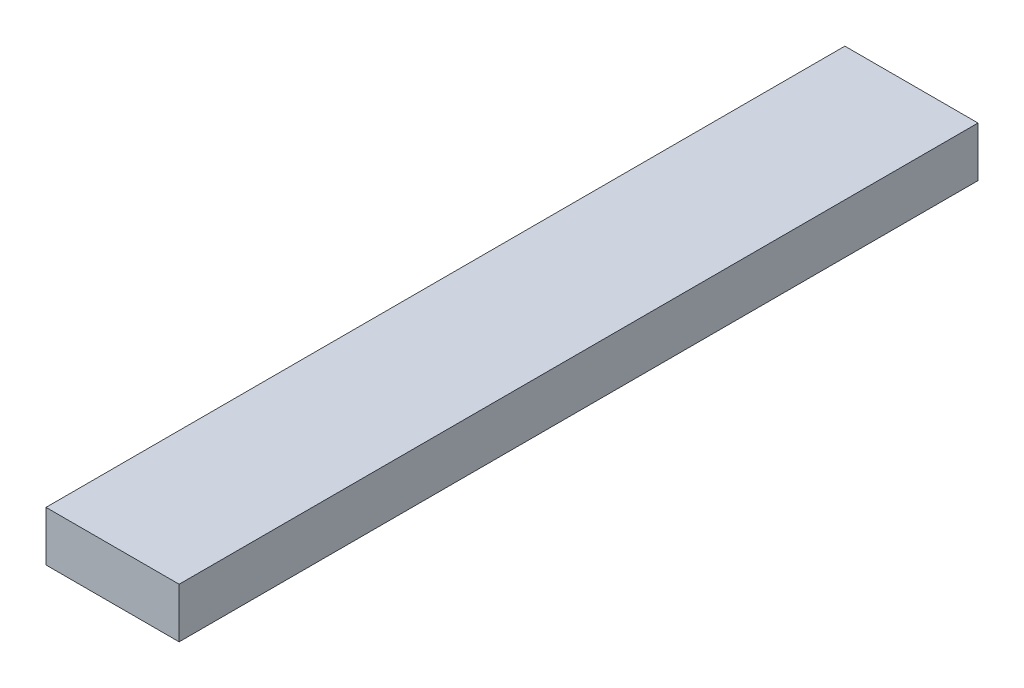
ISO-10303-21;
HEADER;
FILE_DESCRIPTION(('STEP AP214'),'2;1');
FILE_NAME('part.step','',(''),(''),'','','');
FILE_SCHEMA(('AUTOMOTIVE_DESIGN { 1 0 10303 214 1 1 1 1 }'));
ENDSEC;
DATA;
#1=APPLICATION_CONTEXT('core data for automotive mechanical design processes');
#2=APPLICATION_PROTOCOL_DEFINITION('international standard','automotive_design',2000,#1);
#3=PRODUCT_CONTEXT('',#1,'mechanical');
#4=PRODUCT('Part','Part','',(#3));
#5=PRODUCT_RELATED_PRODUCT_CATEGORY('part','',(#4));
#6=PRODUCT_DEFINITION_FORMATION('','',#4);
#7=PRODUCT_DEFINITION_CONTEXT('part definition',#1,'design');
#8=PRODUCT_DEFINITION('design','',#6,#7);
#9=PRODUCT_DEFINITION_SHAPE('','',#8);
#10=(LENGTH_UNIT() NAMED_UNIT(*) SI_UNIT(.MILLI.,.METRE.));
#11=(NAMED_UNIT(*) PLANE_ANGLE_UNIT() SI_UNIT($,.RADIAN.));
#12=(NAMED_UNIT(*) SI_UNIT($,.STERADIAN.) SOLID_ANGLE_UNIT());
#13=UNCERTAINTY_MEASURE_WITH_UNIT(LENGTH_MEASURE(1.E-05),#10,'distance_accuracy_value','');
#14=(GEOMETRIC_REPRESENTATION_CONTEXT(3) GLOBAL_UNCERTAINTY_ASSIGNED_CONTEXT((#13)) GLOBAL_UNIT_ASSIGNED_CONTEXT((#10,
#11,#12)) REPRESENTATION_CONTEXT('',''));
#15=CARTESIAN_POINT('',(0.,0.,0.));
#16=DIRECTION('',(0.,0.,1.));
#17=DIRECTION('',(1.,0.,0.));
#18=AXIS2_PLACEMENT_3D('',#15,#16,#17);
#19=CARTESIAN_POINT('',(-12.7,4.7625,76.2));
#20=DIRECTION('',(1.,0.,0.));
#21=DIRECTION('',(0.,0.,-1.));
#22=AXIS2_PLACEMENT_3D('',#19,#20,#21);
#23=PLANE('',#22);
#24=DIRECTION('',(0.,0.,-1.));
#25=VECTOR('',#24,1.);
#26=CARTESIAN_POINT('',(-12.7,4.7625,76.2));
#27=LINE('',#26,#25);
#28=CARTESIAN_POINT('',(-12.7,4.7625,76.2));
#29=VERTEX_POINT('',#28);
#30=CARTESIAN_POINT('',(-12.7,4.7625,-76.2));
#31=VERTEX_POINT('',#30);
#32=EDGE_CURVE('E92',#29,#31,#27,.T.);
#33=ORIENTED_EDGE('',*,*,#32,.T.);
#34=DIRECTION('',(0.,-1.,0.));
#35=VECTOR('',#34,1.);
#36=CARTESIAN_POINT('',(-12.7,4.7625,-76.2));
#37=LINE('',#36,#35);
#38=CARTESIAN_POINT('',(-12.7,-4.7625,-76.2));
#39=VERTEX_POINT('',#38);
#40=EDGE_CURVE('E87',#31,#39,#37,.T.);
#41=ORIENTED_EDGE('',*,*,#40,.T.);
#42=DIRECTION('',(0.,0.,-1.));
#43=VECTOR('',#42,1.);
#44=CARTESIAN_POINT('',(-12.7,-4.7625,76.2));
#45=LINE('',#44,#43);
#46=CARTESIAN_POINT('',(-12.7,-4.7625,76.2));
#47=VERTEX_POINT('',#46);
#48=EDGE_CURVE('E11',#47,#39,#45,.T.);
#49=ORIENTED_EDGE('',*,*,#48,.F.);
#50=DIRECTION('',(0.,-1.,0.));
#51=VECTOR('',#50,1.);
#52=CARTESIAN_POINT('',(-12.7,4.7625,76.2));
#53=LINE('',#52,#51);
#54=EDGE_CURVE('E98',#29,#47,#53,.T.);
#55=ORIENTED_EDGE('',*,*,#54,.F.);
#56=EDGE_LOOP('',(#33,#41,#49,#55));
#57=FACE_BOUND('',#56,.T.);
#58=ADVANCED_FACE('F35',(#57),#23,.F.);
#59=CARTESIAN_POINT('',(12.7,-4.7625,76.2));
#60=DIRECTION('',(0.,1.,0.));
#61=DIRECTION('',(0.,0.,1.));
#62=AXIS2_PLACEMENT_3D('',#59,#60,#61);
#63=PLANE('',#62);
#64=ORIENTED_EDGE('',*,*,#48,.T.);
#65=DIRECTION('',(1.,0.,0.));
#66=VECTOR('',#65,1.);
#67=CARTESIAN_POINT('',(12.7,-4.7625,-76.2));
#68=LINE('',#67,#66);
#69=CARTESIAN_POINT('',(12.7,-4.7625,-76.2));
#70=VERTEX_POINT('',#69);
#71=EDGE_CURVE('E77',#39,#70,#68,.T.);
#72=ORIENTED_EDGE('',*,*,#71,.T.);
#73=DIRECTION('',(0.,0.,-1.));
#74=VECTOR('',#73,1.);
#75=CARTESIAN_POINT('',(12.7,-4.7625,76.2));
#76=LINE('',#75,#74);
#77=CARTESIAN_POINT('',(12.7,-4.7625,76.2));
#78=VERTEX_POINT('',#77);
#79=EDGE_CURVE('E42',#78,#70,#76,.T.);
#80=ORIENTED_EDGE('',*,*,#79,.F.);
#81=DIRECTION('',(1.,0.,0.));
#82=VECTOR('',#81,1.);
#83=CARTESIAN_POINT('',(12.7,-4.7625,76.2));
#84=LINE('',#83,#82);
#85=EDGE_CURVE('E78',#47,#78,#84,.T.);
#86=ORIENTED_EDGE('',*,*,#85,.F.);
#87=EDGE_LOOP('',(#64,#72,#80,#86));
#88=FACE_BOUND('',#87,.T.);
#89=ADVANCED_FACE('F75',(#88),#63,.F.);
#90=CARTESIAN_POINT('',(12.7,4.7625,76.2));
#91=DIRECTION('',(-1.,0.,0.));
#92=DIRECTION('',(0.,0.,1.));
#93=AXIS2_PLACEMENT_3D('',#90,#91,#92);
#94=PLANE('',#93);
#95=ORIENTED_EDGE('',*,*,#79,.T.);
#96=DIRECTION('',(0.,1.,0.));
#97=VECTOR('',#96,1.);
#98=CARTESIAN_POINT('',(12.7,4.7625,-76.2));
#99=LINE('',#98,#97);
#100=CARTESIAN_POINT('',(12.7,4.7625,-76.2));
#101=VERTEX_POINT('',#100);
#102=EDGE_CURVE('E90',#70,#101,#99,.T.);
#103=ORIENTED_EDGE('',*,*,#102,.T.);
#104=DIRECTION('',(0.,0.,-1.));
#105=VECTOR('',#104,1.);
#106=CARTESIAN_POINT('',(12.7,4.7625,76.2));
#107=LINE('',#106,#105);
#108=CARTESIAN_POINT('',(12.7,4.7625,76.2));
#109=VERTEX_POINT('',#108);
#110=EDGE_CURVE('E104',#109,#101,#107,.T.);
#111=ORIENTED_EDGE('',*,*,#110,.F.);
#112=DIRECTION('',(0.,1.,0.));
#113=VECTOR('',#112,1.);
#114=CARTESIAN_POINT('',(12.7,4.7625,76.2));
#115=LINE('',#114,#113);
#116=EDGE_CURVE('E54',#78,#109,#115,.T.);
#117=ORIENTED_EDGE('',*,*,#116,.F.);
#118=EDGE_LOOP('',(#95,#103,#111,#117));
#119=FACE_BOUND('',#118,.T.);
#120=ADVANCED_FACE('F106',(#119),#94,.F.);
#121=CARTESIAN_POINT('',(12.7,4.7625,76.2));
#122=DIRECTION('',(0.,-1.,0.));
#123=DIRECTION('',(0.,0.,-1.));
#124=AXIS2_PLACEMENT_3D('',#121,#122,#123);
#125=PLANE('',#124);
#126=ORIENTED_EDGE('',*,*,#110,.T.);
#127=DIRECTION('',(-1.,0.,0.));
#128=VECTOR('',#127,1.);
#129=CARTESIAN_POINT('',(12.7,4.7625,-76.2));
#130=LINE('',#129,#128);
#131=EDGE_CURVE('E96',#101,#31,#130,.T.);
#132=ORIENTED_EDGE('',*,*,#131,.T.);
#133=ORIENTED_EDGE('',*,*,#32,.F.);
#134=DIRECTION('',(-1.,0.,0.));
#135=VECTOR('',#134,1.);
#136=CARTESIAN_POINT('',(12.7,4.7625,76.2));
#137=LINE('',#136,#135);
#138=EDGE_CURVE('E49',#109,#29,#137,.T.);
#139=ORIENTED_EDGE('',*,*,#138,.F.);
#140=EDGE_LOOP('',(#126,#132,#133,#139));
#141=FACE_BOUND('',#140,.T.);
#142=ADVANCED_FACE('F108',(#141),#125,.F.);
#143=CARTESIAN_POINT('',(0.,0.,76.2));
#144=DIRECTION('',(0.,0.,-1.));
#145=DIRECTION('',(-1.,0.,0.));
#146=AXIS2_PLACEMENT_3D('',#143,#144,#145);
#147=PLANE('',#146);
#148=ORIENTED_EDGE('',*,*,#54,.T.);
#149=ORIENTED_EDGE('',*,*,#85,.T.);
#150=ORIENTED_EDGE('',*,*,#116,.T.);
#151=ORIENTED_EDGE('',*,*,#138,.T.);
#152=EDGE_LOOP('',(#148,#149,#150,#151));
#153=FACE_BOUND('',#152,.T.);
#154=ADVANCED_FACE('F109',(#153),#147,.F.);
#155=CARTESIAN_POINT('',(0.,0.,-76.2));
#156=DIRECTION('',(0.,0.,-1.));
#157=DIRECTION('',(-1.,0.,0.));
#158=AXIS2_PLACEMENT_3D('',#155,#156,#157);
#159=PLANE('',#158);
#160=ORIENTED_EDGE('',*,*,#40,.F.);
#161=ORIENTED_EDGE('',*,*,#131,.F.);
#162=ORIENTED_EDGE('',*,*,#102,.F.);
#163=ORIENTED_EDGE('',*,*,#71,.F.);
#164=EDGE_LOOP('',(#160,#161,#162,#163));
#165=FACE_BOUND('',#164,.T.);
#166=ADVANCED_FACE('F85',(#165),#159,.T.);
#167=CLOSED_SHELL('',(#58,#89,#120,#142,#154,#166));
#168=MANIFOLD_SOLID_BREP('B2',#167);
#169=ADVANCED_BREP_SHAPE_REPRESENTATION('',(#18,#168),#14);
#170=SHAPE_DEFINITION_REPRESENTATION(#9,#169);
ENDSEC;
END-ISO-10303-21;
